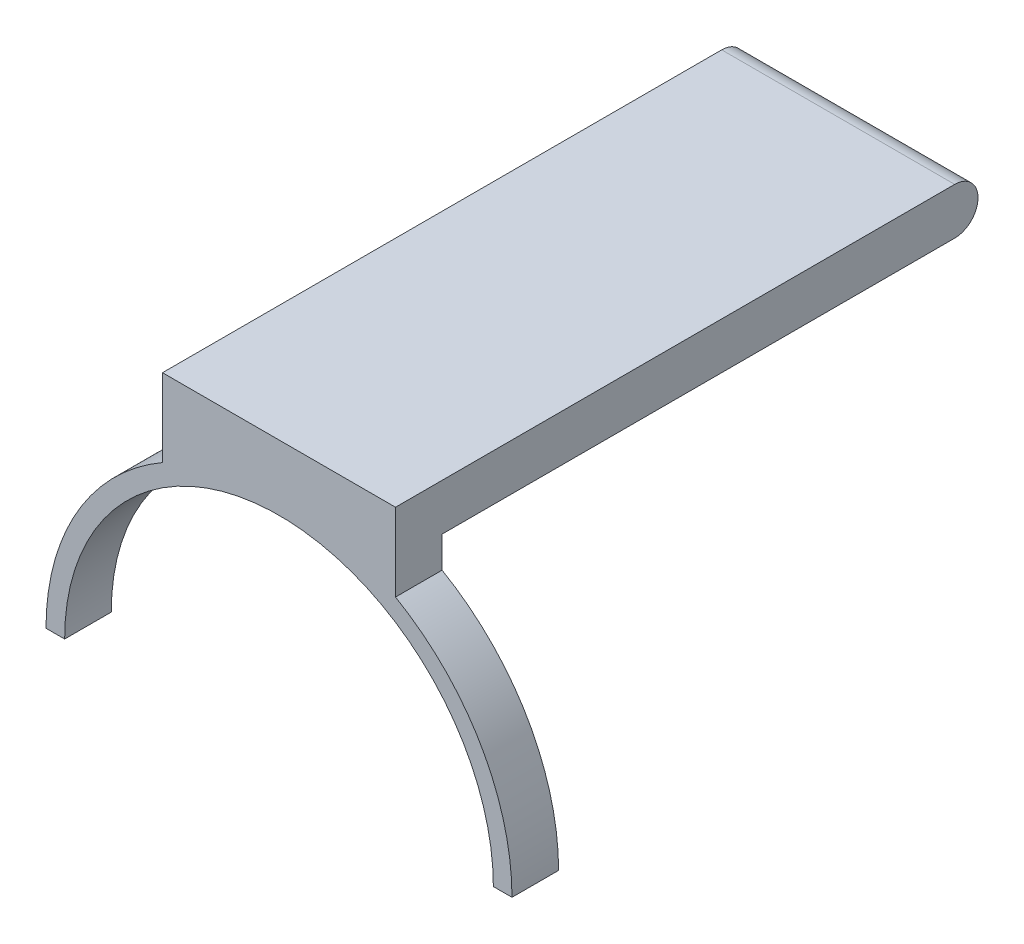
ISO-10303-21;
HEADER;
FILE_DESCRIPTION(('STEP AP214'),'2;1');
FILE_NAME('part.step','',(''),(''),'','','');
FILE_SCHEMA(('AUTOMOTIVE_DESIGN { 1 0 10303 214 1 1 1 1 }'));
ENDSEC;
DATA;
#1=APPLICATION_CONTEXT('core data for automotive mechanical design processes');
#2=APPLICATION_PROTOCOL_DEFINITION('international standard','automotive_design',2000,#1);
#3=PRODUCT_CONTEXT('',#1,'mechanical');
#4=PRODUCT('Part','Part','',(#3));
#5=PRODUCT_RELATED_PRODUCT_CATEGORY('part','',(#4));
#6=PRODUCT_DEFINITION_FORMATION('','',#4);
#7=PRODUCT_DEFINITION_CONTEXT('part definition',#1,'design');
#8=PRODUCT_DEFINITION('design','',#6,#7);
#9=PRODUCT_DEFINITION_SHAPE('','',#8);
#10=(LENGTH_UNIT() NAMED_UNIT(*) SI_UNIT(.MILLI.,.METRE.));
#11=(NAMED_UNIT(*) PLANE_ANGLE_UNIT() SI_UNIT($,.RADIAN.));
#12=(NAMED_UNIT(*) SI_UNIT($,.STERADIAN.) SOLID_ANGLE_UNIT());
#13=UNCERTAINTY_MEASURE_WITH_UNIT(LENGTH_MEASURE(1.E-05),#10,'distance_accuracy_value','');
#14=(GEOMETRIC_REPRESENTATION_CONTEXT(3) GLOBAL_UNCERTAINTY_ASSIGNED_CONTEXT((#13)) GLOBAL_UNIT_ASSIGNED_CONTEXT((#10,
#11,#12)) REPRESENTATION_CONTEXT('',''));
#15=CARTESIAN_POINT('',(0.,0.,0.));
#16=DIRECTION('',(0.,0.,1.));
#17=DIRECTION('',(1.,0.,0.));
#18=AXIS2_PLACEMENT_3D('',#15,#16,#17);
#19=CARTESIAN_POINT('',(-25.,5.,120.));
#20=DIRECTION('',(1.,0.,0.));
#21=DIRECTION('',(0.,0.,-1.));
#22=AXIS2_PLACEMENT_3D('',#19,#20,#21);
#23=PLANE('',#22);
#24=DIRECTION('',(0.,0.,-1.));
#25=VECTOR('',#24,1.);
#26=CARTESIAN_POINT('',(-25.,5.,120.));
#27=LINE('',#26,#25);
#28=CARTESIAN_POINT('',(-25.,5.,120.));
#29=VERTEX_POINT('',#28);
#30=CARTESIAN_POINT('',(-25.,5.,0.));
#31=VERTEX_POINT('',#30);
#32=EDGE_CURVE('E202',#29,#31,#27,.T.);
#33=ORIENTED_EDGE('',*,*,#32,.T.);
#34=CARTESIAN_POINT('',(-25.,0.,0.));
#35=DIRECTION('',(1.,0.,0.));
#36=DIRECTION('',(0.,0.,-1.));
#37=AXIS2_PLACEMENT_3D('',#34,#35,#36);
#38=CIRCLE('',#37,5.);
#39=CARTESIAN_POINT('',(-25.,-5.,0.));
#40=VERTEX_POINT('',#39);
#41=EDGE_CURVE('E165',#40,#31,#38,.T.);
#42=ORIENTED_EDGE('',*,*,#41,.F.);
#43=DIRECTION('',(0.,0.,-1.));
#44=VECTOR('',#43,1.);
#45=CARTESIAN_POINT('',(-25.,-5.,120.));
#46=LINE('',#45,#44);
#47=CARTESIAN_POINT('',(-25.,-5.,110.));
#48=VERTEX_POINT('',#47);
#49=EDGE_CURVE('E11',#48,#40,#46,.T.);
#50=ORIENTED_EDGE('',*,*,#49,.F.);
#51=DIRECTION('',(0.,-1.,0.));
#52=VECTOR('',#51,1.);
#53=CARTESIAN_POINT('',(-25.,-5.,110.));
#54=LINE('',#53,#52);
#55=CARTESIAN_POINT('',(-25.,-11.6987298107781,110.));
#56=VERTEX_POINT('',#55);
#57=EDGE_CURVE('E54',#48,#56,#54,.T.);
#58=ORIENTED_EDGE('',*,*,#57,.T.);
#59=DIRECTION('',(0.,0.,1.));
#60=VECTOR('',#59,1.);
#61=CARTESIAN_POINT('',(-25.,-11.6987298107781,110.));
#62=LINE('',#61,#60);
#63=CARTESIAN_POINT('',(-25.,-11.6987298107781,120.));
#64=VERTEX_POINT('',#63);
#65=EDGE_CURVE('E131',#56,#64,#62,.T.);
#66=ORIENTED_EDGE('',*,*,#65,.T.);
#67=DIRECTION('',(0.,-1.,0.));
#68=VECTOR('',#67,1.);
#69=CARTESIAN_POINT('',(-25.,5.,120.));
#70=LINE('',#69,#68);
#71=EDGE_CURVE('E193',#29,#64,#70,.T.);
#72=ORIENTED_EDGE('',*,*,#71,.F.);
#73=EDGE_LOOP('',(#33,#42,#50,#58,#66,#72));
#74=FACE_BOUND('',#73,.T.);
#75=ADVANCED_FACE('F39',(#74),#23,.F.);
#76=CARTESIAN_POINT('',(-25.,-5.,120.));
#77=DIRECTION('',(0.,1.,0.));
#78=DIRECTION('',(0.,0.,1.));
#79=AXIS2_PLACEMENT_3D('',#76,#77,#78);
#80=PLANE('',#79);
#81=DIRECTION('',(0.,0.,-1.));
#82=VECTOR('',#81,1.);
#83=CARTESIAN_POINT('',(25.,-5.,120.));
#84=LINE('',#83,#82);
#85=CARTESIAN_POINT('',(25.,-5.,110.));
#86=VERTEX_POINT('',#85);
#87=CARTESIAN_POINT('',(25.,-5.,0.));
#88=VERTEX_POINT('',#87);
#89=EDGE_CURVE('E47',#86,#88,#84,.T.);
#90=ORIENTED_EDGE('',*,*,#89,.F.);
#91=DIRECTION('',(-1.,0.,0.));
#92=VECTOR('',#91,1.);
#93=CARTESIAN_POINT('',(-25.,-5.,110.));
#94=LINE('',#93,#92);
#95=EDGE_CURVE('E151',#86,#48,#94,.T.);
#96=ORIENTED_EDGE('',*,*,#95,.T.);
#97=ORIENTED_EDGE('',*,*,#49,.T.);
#98=DIRECTION('',(1.,0.,0.));
#99=VECTOR('',#98,1.);
#100=CARTESIAN_POINT('',(-25.,-5.,0.));
#101=LINE('',#100,#99);
#102=EDGE_CURVE('E182',#40,#88,#101,.T.);
#103=ORIENTED_EDGE('',*,*,#102,.T.);
#104=EDGE_LOOP('',(#90,#96,#97,#103));
#105=FACE_BOUND('',#104,.T.);
#106=ADVANCED_FACE('F224',(#105),#80,.F.);
#107=CARTESIAN_POINT('',(25.,5.,120.));
#108=DIRECTION('',(-1.,0.,0.));
#109=DIRECTION('',(0.,0.,1.));
#110=AXIS2_PLACEMENT_3D('',#107,#108,#109);
#111=PLANE('',#110);
#112=ORIENTED_EDGE('',*,*,#89,.T.);
#113=CARTESIAN_POINT('',(25.,0.,0.));
#114=DIRECTION('',(1.,0.,0.));
#115=DIRECTION('',(0.,0.,-1.));
#116=AXIS2_PLACEMENT_3D('',#113,#114,#115);
#117=CIRCLE('',#116,5.);
#118=CARTESIAN_POINT('',(25.,5.,0.));
#119=VERTEX_POINT('',#118);
#120=EDGE_CURVE('E74',#88,#119,#117,.T.);
#121=ORIENTED_EDGE('',*,*,#120,.T.);
#122=DIRECTION('',(0.,0.,-1.));
#123=VECTOR('',#122,1.);
#124=CARTESIAN_POINT('',(25.,5.,120.));
#125=LINE('',#124,#123);
#126=CARTESIAN_POINT('',(25.,5.,120.));
#127=VERTEX_POINT('',#126);
#128=EDGE_CURVE('E211',#127,#119,#125,.T.);
#129=ORIENTED_EDGE('',*,*,#128,.F.);
#130=DIRECTION('',(0.,1.,0.));
#131=VECTOR('',#130,1.);
#132=CARTESIAN_POINT('',(25.,5.,120.));
#133=LINE('',#132,#131);
#134=CARTESIAN_POINT('',(25.,-11.6987298107781,120.));
#135=VERTEX_POINT('',#134);
#136=EDGE_CURVE('E196',#135,#127,#133,.T.);
#137=ORIENTED_EDGE('',*,*,#136,.F.);
#138=DIRECTION('',(0.,0.,1.));
#139=VECTOR('',#138,1.);
#140=CARTESIAN_POINT('',(25.,-11.6987298107781,110.));
#141=LINE('',#140,#139);
#142=CARTESIAN_POINT('',(25.,-11.6987298107781,110.));
#143=VERTEX_POINT('',#142);
#144=EDGE_CURVE('E141',#143,#135,#141,.T.);
#145=ORIENTED_EDGE('',*,*,#144,.F.);
#146=DIRECTION('',(0.,1.,0.));
#147=VECTOR('',#146,1.);
#148=CARTESIAN_POINT('',(25.,-5.,110.));
#149=LINE('',#148,#147);
#150=EDGE_CURVE('E154',#143,#86,#149,.T.);
#151=ORIENTED_EDGE('',*,*,#150,.T.);
#152=EDGE_LOOP('',(#112,#121,#129,#137,#145,#151));
#153=FACE_BOUND('',#152,.T.);
#154=ADVANCED_FACE('F218',(#153),#111,.F.);
#155=CARTESIAN_POINT('',(-25.,5.,120.));
#156=DIRECTION('',(0.,-1.,0.));
#157=DIRECTION('',(0.,0.,-1.));
#158=AXIS2_PLACEMENT_3D('',#155,#156,#157);
#159=PLANE('',#158);
#160=DIRECTION('',(-1.,0.,0.));
#161=VECTOR('',#160,1.);
#162=CARTESIAN_POINT('',(-25.,5.,0.));
#163=LINE('',#162,#161);
#164=EDGE_CURVE('E197',#119,#31,#163,.T.);
#165=ORIENTED_EDGE('',*,*,#164,.T.);
#166=ORIENTED_EDGE('',*,*,#32,.F.);
#167=DIRECTION('',(-1.,0.,0.));
#168=VECTOR('',#167,1.);
#169=CARTESIAN_POINT('',(-25.,5.,120.));
#170=LINE('',#169,#168);
#171=EDGE_CURVE('E63',#127,#29,#170,.T.);
#172=ORIENTED_EDGE('',*,*,#171,.F.);
#173=ORIENTED_EDGE('',*,*,#128,.T.);
#174=EDGE_LOOP('',(#165,#166,#172,#173));
#175=FACE_BOUND('',#174,.T.);
#176=ADVANCED_FACE('F266',(#175),#159,.F.);
#177=CARTESIAN_POINT('',(0.,0.,120.));
#178=DIRECTION('',(0.,0.,1.));
#179=DIRECTION('',(1.,0.,0.));
#180=AXIS2_PLACEMENT_3D('',#177,#178,#179);
#181=PLANE('',#180);
#182=ORIENTED_EDGE('',*,*,#71,.T.);
#183=CARTESIAN_POINT('',(0.,-55.,120.));
#184=DIRECTION('',(0.,0.,1.));
#185=DIRECTION('',(1.,0.,0.));
#186=AXIS2_PLACEMENT_3D('',#183,#184,#185);
#187=CIRCLE('',#186,50.);
#188=CARTESIAN_POINT('',(-50.,-55.,120.));
#189=VERTEX_POINT('',#188);
#190=EDGE_CURVE('E136',#64,#189,#187,.T.);
#191=ORIENTED_EDGE('',*,*,#190,.T.);
#192=DIRECTION('',(1.,0.,0.));
#193=VECTOR('',#192,1.);
#194=CARTESIAN_POINT('',(-50.,-55.,120.));
#195=LINE('',#194,#193);
#196=CARTESIAN_POINT('',(-46.,-55.,120.));
#197=VERTEX_POINT('',#196);
#198=EDGE_CURVE('E175',#189,#197,#195,.T.);
#199=ORIENTED_EDGE('',*,*,#198,.T.);
#200=CARTESIAN_POINT('',(0.,-55.,120.));
#201=DIRECTION('',(0.,0.,-1.));
#202=DIRECTION('',(1.,0.,0.));
#203=AXIS2_PLACEMENT_3D('',#200,#201,#202);
#204=CIRCLE('',#203,46.);
#205=CARTESIAN_POINT('',(46.,-55.,120.));
#206=VERTEX_POINT('',#205);
#207=EDGE_CURVE('E160',#197,#206,#204,.T.);
#208=ORIENTED_EDGE('',*,*,#207,.T.);
#209=DIRECTION('',(1.,0.,0.));
#210=VECTOR('',#209,1.);
#211=CARTESIAN_POINT('',(46.,-55.,120.));
#212=LINE('',#211,#210);
#213=CARTESIAN_POINT('',(50.,-55.,120.));
#214=VERTEX_POINT('',#213);
#215=EDGE_CURVE('E164',#206,#214,#212,.T.);
#216=ORIENTED_EDGE('',*,*,#215,.T.);
#217=CARTESIAN_POINT('',(0.,-55.,120.));
#218=DIRECTION('',(0.,0.,1.));
#219=DIRECTION('',(1.,0.,0.));
#220=AXIS2_PLACEMENT_3D('',#217,#218,#219);
#221=CIRCLE('',#220,50.);
#222=EDGE_CURVE('E169',#214,#135,#221,.T.);
#223=ORIENTED_EDGE('',*,*,#222,.T.);
#224=ORIENTED_EDGE('',*,*,#136,.T.);
#225=ORIENTED_EDGE('',*,*,#171,.T.);
#226=EDGE_LOOP('',(#182,#191,#199,#208,#216,#223,#224,#225));
#227=FACE_BOUND('',#226,.T.);
#228=ADVANCED_FACE('F247',(#227),#181,.T.);
#229=CARTESIAN_POINT('',(0.,-55.,110.));
#230=DIRECTION('',(0.,0.,1.));
#231=DIRECTION('',(1.,0.,0.));
#232=AXIS2_PLACEMENT_3D('',#229,#230,#231);
#233=CYLINDRICAL_SURFACE('',#232,46.);
#234=ORIENTED_EDGE('',*,*,#207,.F.);
#235=DIRECTION('',(0.,0.,1.));
#236=VECTOR('',#235,1.);
#237=CARTESIAN_POINT('',(-46.,-55.,110.));
#238=LINE('',#237,#236);
#239=CARTESIAN_POINT('',(-46.,-55.,110.));
#240=VERTEX_POINT('',#239);
#241=EDGE_CURVE('E83',#240,#197,#238,.T.);
#242=ORIENTED_EDGE('',*,*,#241,.F.);
#243=CARTESIAN_POINT('',(0.,-55.,110.));
#244=DIRECTION('',(0.,0.,-1.));
#245=DIRECTION('',(1.,0.,0.));
#246=AXIS2_PLACEMENT_3D('',#243,#244,#245);
#247=CIRCLE('',#246,46.);
#248=CARTESIAN_POINT('',(46.,-55.,110.));
#249=VERTEX_POINT('',#248);
#250=EDGE_CURVE('E179',#240,#249,#247,.T.);
#251=ORIENTED_EDGE('',*,*,#250,.T.);
#252=DIRECTION('',(0.,0.,1.));
#253=VECTOR('',#252,1.);
#254=CARTESIAN_POINT('',(46.,-55.,110.));
#255=LINE('',#254,#253);
#256=EDGE_CURVE('E115',#249,#206,#255,.T.);
#257=ORIENTED_EDGE('',*,*,#256,.T.);
#258=EDGE_LOOP('',(#234,#242,#251,#257));
#259=FACE_BOUND('',#258,.T.);
#260=ADVANCED_FACE('F248',(#259),#233,.F.);
#261=CARTESIAN_POINT('',(-50.,-55.,110.));
#262=DIRECTION('',(0.,-1.,0.));
#263=DIRECTION('',(0.,0.,-1.));
#264=AXIS2_PLACEMENT_3D('',#261,#262,#263);
#265=PLANE('',#264);
#266=ORIENTED_EDGE('',*,*,#198,.F.);
#267=DIRECTION('',(0.,0.,1.));
#268=VECTOR('',#267,1.);
#269=CARTESIAN_POINT('',(-50.,-55.,110.));
#270=LINE('',#269,#268);
#271=CARTESIAN_POINT('',(-50.,-55.,110.));
#272=VERTEX_POINT('',#271);
#273=EDGE_CURVE('E140',#272,#189,#270,.T.);
#274=ORIENTED_EDGE('',*,*,#273,.F.);
#275=DIRECTION('',(1.,0.,0.));
#276=VECTOR('',#275,1.);
#277=CARTESIAN_POINT('',(-50.,-55.,110.));
#278=LINE('',#277,#276);
#279=EDGE_CURVE('E144',#272,#240,#278,.T.);
#280=ORIENTED_EDGE('',*,*,#279,.T.);
#281=ORIENTED_EDGE('',*,*,#241,.T.);
#282=EDGE_LOOP('',(#266,#274,#280,#281));
#283=FACE_BOUND('',#282,.T.);
#284=ADVANCED_FACE('F249',(#283),#265,.T.);
#285=CARTESIAN_POINT('',(0.,-55.,110.));
#286=DIRECTION('',(0.,0.,1.));
#287=DIRECTION('',(1.,0.,0.));
#288=AXIS2_PLACEMENT_3D('',#285,#286,#287);
#289=CYLINDRICAL_SURFACE('',#288,50.);
#290=ORIENTED_EDGE('',*,*,#190,.F.);
#291=ORIENTED_EDGE('',*,*,#65,.F.);
#292=CARTESIAN_POINT('',(0.,-55.,110.));
#293=DIRECTION('',(0.,0.,1.));
#294=DIRECTION('',(1.,0.,0.));
#295=AXIS2_PLACEMENT_3D('',#292,#293,#294);
#296=CIRCLE('',#295,50.);
#297=EDGE_CURVE('E133',#56,#272,#296,.T.);
#298=ORIENTED_EDGE('',*,*,#297,.T.);
#299=ORIENTED_EDGE('',*,*,#273,.T.);
#300=EDGE_LOOP('',(#290,#291,#298,#299));
#301=FACE_BOUND('',#300,.T.);
#302=ADVANCED_FACE('F132',(#301),#289,.T.);
#303=CARTESIAN_POINT('',(0.,-55.,110.));
#304=DIRECTION('',(0.,0.,1.));
#305=DIRECTION('',(1.,0.,0.));
#306=AXIS2_PLACEMENT_3D('',#303,#304,#305);
#307=CYLINDRICAL_SURFACE('',#306,50.);
#308=ORIENTED_EDGE('',*,*,#222,.F.);
#309=DIRECTION('',(0.,0.,1.));
#310=VECTOR('',#309,1.);
#311=CARTESIAN_POINT('',(50.,-55.,110.));
#312=LINE('',#311,#310);
#313=CARTESIAN_POINT('',(50.,-55.,110.));
#314=VERTEX_POINT('',#313);
#315=EDGE_CURVE('E188',#314,#214,#312,.T.);
#316=ORIENTED_EDGE('',*,*,#315,.F.);
#317=CARTESIAN_POINT('',(0.,-55.,110.));
#318=DIRECTION('',(0.,0.,1.));
#319=DIRECTION('',(1.,0.,0.));
#320=AXIS2_PLACEMENT_3D('',#317,#318,#319);
#321=CIRCLE('',#320,50.);
#322=EDGE_CURVE('E238',#314,#143,#321,.T.);
#323=ORIENTED_EDGE('',*,*,#322,.T.);
#324=ORIENTED_EDGE('',*,*,#144,.T.);
#325=EDGE_LOOP('',(#308,#316,#323,#324));
#326=FACE_BOUND('',#325,.T.);
#327=ADVANCED_FACE('F245',(#326),#307,.T.);
#328=CARTESIAN_POINT('',(46.,-55.,110.));
#329=DIRECTION('',(0.,-1.,0.));
#330=DIRECTION('',(0.,0.,-1.));
#331=AXIS2_PLACEMENT_3D('',#328,#329,#330);
#332=PLANE('',#331);
#333=ORIENTED_EDGE('',*,*,#215,.F.);
#334=ORIENTED_EDGE('',*,*,#256,.F.);
#335=DIRECTION('',(1.,0.,0.));
#336=VECTOR('',#335,1.);
#337=CARTESIAN_POINT('',(46.,-55.,110.));
#338=LINE('',#337,#336);
#339=EDGE_CURVE('E235',#249,#314,#338,.T.);
#340=ORIENTED_EDGE('',*,*,#339,.T.);
#341=ORIENTED_EDGE('',*,*,#315,.T.);
#342=EDGE_LOOP('',(#333,#334,#340,#341));
#343=FACE_BOUND('',#342,.T.);
#344=ADVANCED_FACE('F246',(#343),#332,.T.);
#345=CARTESIAN_POINT('',(0.,-55.,110.));
#346=DIRECTION('',(0.,0.,1.));
#347=DIRECTION('',(1.,0.,0.));
#348=AXIS2_PLACEMENT_3D('',#345,#346,#347);
#349=PLANE('',#348);
#350=ORIENTED_EDGE('',*,*,#250,.F.);
#351=ORIENTED_EDGE('',*,*,#279,.F.);
#352=ORIENTED_EDGE('',*,*,#297,.F.);
#353=ORIENTED_EDGE('',*,*,#57,.F.);
#354=ORIENTED_EDGE('',*,*,#95,.F.);
#355=ORIENTED_EDGE('',*,*,#150,.F.);
#356=ORIENTED_EDGE('',*,*,#322,.F.);
#357=ORIENTED_EDGE('',*,*,#339,.F.);
#358=EDGE_LOOP('',(#350,#351,#352,#353,#354,#355,#356,#357));
#359=FACE_BOUND('',#358,.T.);
#360=ADVANCED_FACE('F143',(#359),#349,.F.);
#361=CARTESIAN_POINT('',(-25.,0.,0.));
#362=DIRECTION('',(1.,0.,0.));
#363=DIRECTION('',(0.,0.,-1.));
#364=AXIS2_PLACEMENT_3D('',#361,#362,#363);
#365=CYLINDRICAL_SURFACE('',#364,5.);
#366=ORIENTED_EDGE('',*,*,#102,.F.);
#367=ORIENTED_EDGE('',*,*,#41,.T.);
#368=ORIENTED_EDGE('',*,*,#164,.F.);
#369=ORIENTED_EDGE('',*,*,#120,.F.);
#370=EDGE_LOOP('',(#366,#367,#368,#369));
#371=FACE_BOUND('',#370,.T.);
#372=ADVANCED_FACE('F227',(#371),#365,.T.);
#373=CLOSED_SHELL('',(#75,#106,#154,#176,#228,#260,#284,#302,#327,#344,#360,#372));
#374=MANIFOLD_SOLID_BREP('B2',#373);
#375=ADVANCED_BREP_SHAPE_REPRESENTATION('',(#18,#374),#14);
#376=SHAPE_DEFINITION_REPRESENTATION(#9,#375);
ENDSEC;
END-ISO-10303-21;
